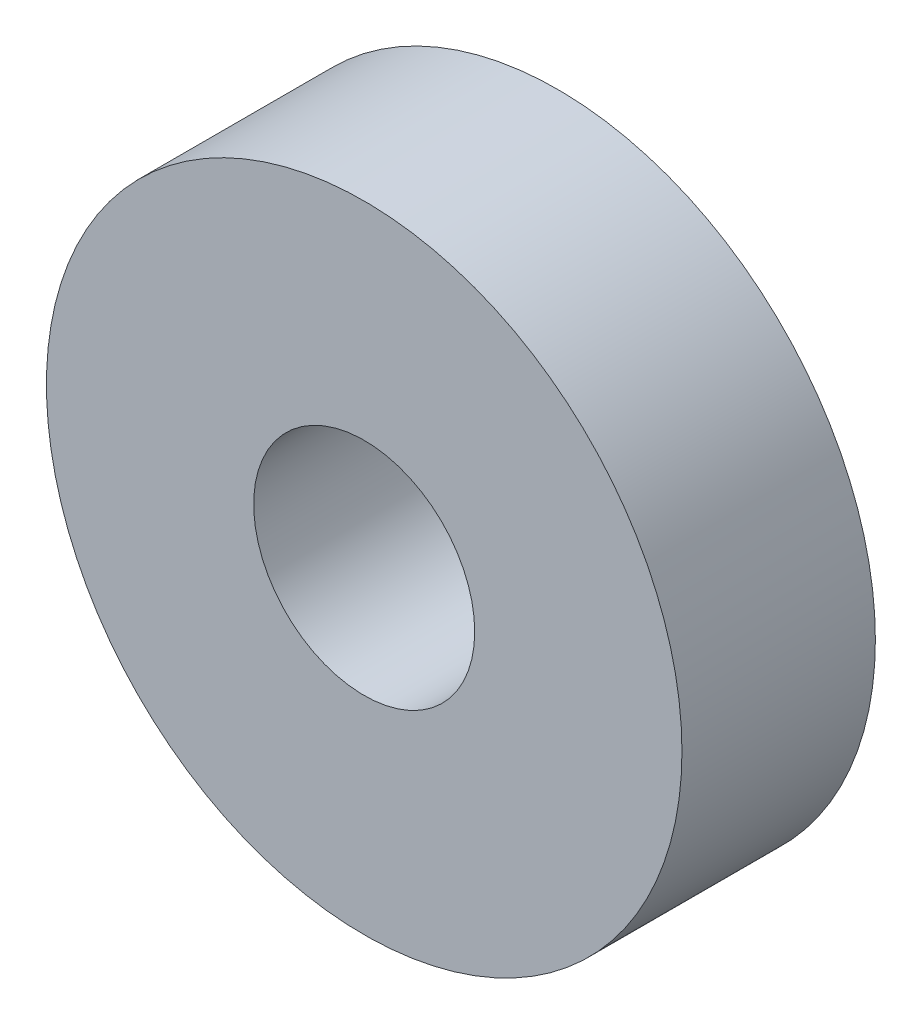
ISO-10303-21;
HEADER;
FILE_DESCRIPTION(('STEP AP214'),'2;1');
FILE_NAME('part.step','',(''),(''),'','','');
FILE_SCHEMA(('AUTOMOTIVE_DESIGN { 1 0 10303 214 1 1 1 1 }'));
ENDSEC;
DATA;
#1=APPLICATION_CONTEXT('core data for automotive mechanical design processes');
#2=APPLICATION_PROTOCOL_DEFINITION('international standard','automotive_design',2000,#1);
#3=PRODUCT_CONTEXT('',#1,'mechanical');
#4=PRODUCT('Part','Part','',(#3));
#5=PRODUCT_RELATED_PRODUCT_CATEGORY('part','',(#4));
#6=PRODUCT_DEFINITION_FORMATION('','',#4);
#7=PRODUCT_DEFINITION_CONTEXT('part definition',#1,'design');
#8=PRODUCT_DEFINITION('design','',#6,#7);
#9=PRODUCT_DEFINITION_SHAPE('','',#8);
#10=(LENGTH_UNIT() NAMED_UNIT(*) SI_UNIT(.MILLI.,.METRE.));
#11=(NAMED_UNIT(*) PLANE_ANGLE_UNIT() SI_UNIT($,.RADIAN.));
#12=(NAMED_UNIT(*) SI_UNIT($,.STERADIAN.) SOLID_ANGLE_UNIT());
#13=UNCERTAINTY_MEASURE_WITH_UNIT(LENGTH_MEASURE(1.E-05),#10,'distance_accuracy_value','');
#14=(GEOMETRIC_REPRESENTATION_CONTEXT(3) GLOBAL_UNCERTAINTY_ASSIGNED_CONTEXT((#13)) GLOBAL_UNIT_ASSIGNED_CONTEXT((#10,
#11,#12)) REPRESENTATION_CONTEXT('',''));
#15=CARTESIAN_POINT('',(0.,0.,0.));
#16=DIRECTION('',(0.,0.,1.));
#17=DIRECTION('',(1.,0.,0.));
#18=AXIS2_PLACEMENT_3D('',#15,#16,#17);
#19=CARTESIAN_POINT('',(0.,0.,7.));
#20=DIRECTION('',(0.,0.,1.));
#21=DIRECTION('',(1.,0.,0.));
#22=AXIS2_PLACEMENT_3D('',#19,#20,#21);
#23=PLANE('',#22);
#24=CARTESIAN_POINT('',(0.,0.,7.));
#25=DIRECTION('',(0.,0.,1.));
#26=DIRECTION('',(1.,0.,0.));
#27=AXIS2_PLACEMENT_3D('',#24,#25,#26);
#28=CIRCLE('',#27,11.5);
#29=CARTESIAN_POINT('',(11.5,0.,7.));
#30=VERTEX_POINT('',#29);
#31=EDGE_CURVE('E10',#30,#30,#28,.T.);
#32=ORIENTED_EDGE('',*,*,#31,.T.);
#33=EDGE_LOOP('',(#32));
#34=FACE_BOUND('',#33,.T.);
#35=CARTESIAN_POINT('',(0.,0.,7.));
#36=DIRECTION('',(0.,0.,1.));
#37=DIRECTION('',(1.,0.,0.));
#38=AXIS2_PLACEMENT_3D('',#35,#36,#37);
#39=CIRCLE('',#38,4.);
#40=CARTESIAN_POINT('',(4.,0.,7.));
#41=VERTEX_POINT('',#40);
#42=EDGE_CURVE('E48',#41,#41,#39,.T.);
#43=ORIENTED_EDGE('',*,*,#42,.F.);
#44=EDGE_LOOP('',(#43));
#45=FACE_BOUND('',#44,.T.);
#46=ADVANCED_FACE('F37',(#34,#45),#23,.T.);
#47=CARTESIAN_POINT('',(0.,0.,0.));
#48=DIRECTION('',(0.,0.,1.));
#49=DIRECTION('',(1.,0.,0.));
#50=AXIS2_PLACEMENT_3D('',#47,#48,#49);
#51=PLANE('',#50);
#52=CARTESIAN_POINT('',(0.,0.,0.));
#53=DIRECTION('',(0.,0.,1.));
#54=DIRECTION('',(1.,0.,0.));
#55=AXIS2_PLACEMENT_3D('',#52,#53,#54);
#56=CIRCLE('',#55,11.5);
#57=CARTESIAN_POINT('',(11.5,0.,0.));
#58=VERTEX_POINT('',#57);
#59=EDGE_CURVE('E41',#58,#58,#56,.T.);
#60=ORIENTED_EDGE('',*,*,#59,.F.);
#61=EDGE_LOOP('',(#60));
#62=FACE_BOUND('',#61,.T.);
#63=CARTESIAN_POINT('',(0.,0.,0.));
#64=DIRECTION('',(0.,0.,1.));
#65=DIRECTION('',(1.,0.,0.));
#66=AXIS2_PLACEMENT_3D('',#63,#64,#65);
#67=CIRCLE('',#66,4.);
#68=CARTESIAN_POINT('',(4.,0.,0.));
#69=VERTEX_POINT('',#68);
#70=EDGE_CURVE('E50',#69,#69,#67,.T.);
#71=ORIENTED_EDGE('',*,*,#70,.T.);
#72=EDGE_LOOP('',(#71));
#73=FACE_BOUND('',#72,.T.);
#74=ADVANCED_FACE('F60',(#62,#73),#51,.F.);
#75=CARTESIAN_POINT('',(0.,0.,7.));
#76=DIRECTION('',(0.,0.,-1.));
#77=DIRECTION('',(-1.,0.,0.));
#78=AXIS2_PLACEMENT_3D('',#75,#76,#77);
#79=CYLINDRICAL_SURFACE('',#78,11.5);
#80=ORIENTED_EDGE('',*,*,#31,.F.);
#81=EDGE_LOOP('',(#80));
#82=FACE_BOUND('',#81,.T.);
#83=ORIENTED_EDGE('',*,*,#59,.T.);
#84=EDGE_LOOP('',(#83));
#85=FACE_BOUND('',#84,.T.);
#86=ADVANCED_FACE('F39',(#82,#85),#79,.T.);
#87=CARTESIAN_POINT('',(0.,0.,7.));
#88=DIRECTION('',(0.,0.,-1.));
#89=DIRECTION('',(-1.,0.,0.));
#90=AXIS2_PLACEMENT_3D('',#87,#88,#89);
#91=CYLINDRICAL_SURFACE('',#90,4.);
#92=ORIENTED_EDGE('',*,*,#42,.T.);
#93=EDGE_LOOP('',(#92));
#94=FACE_BOUND('',#93,.T.);
#95=ORIENTED_EDGE('',*,*,#70,.F.);
#96=EDGE_LOOP('',(#95));
#97=FACE_BOUND('',#96,.T.);
#98=ADVANCED_FACE('F56',(#94,#97),#91,.F.);
#99=CLOSED_SHELL('',(#46,#74,#86,#98));
#100=MANIFOLD_SOLID_BREP('B2',#99);
#101=ADVANCED_BREP_SHAPE_REPRESENTATION('',(#18,#100),#14);
#102=SHAPE_DEFINITION_REPRESENTATION(#9,#101);
ENDSEC;
END-ISO-10303-21;
